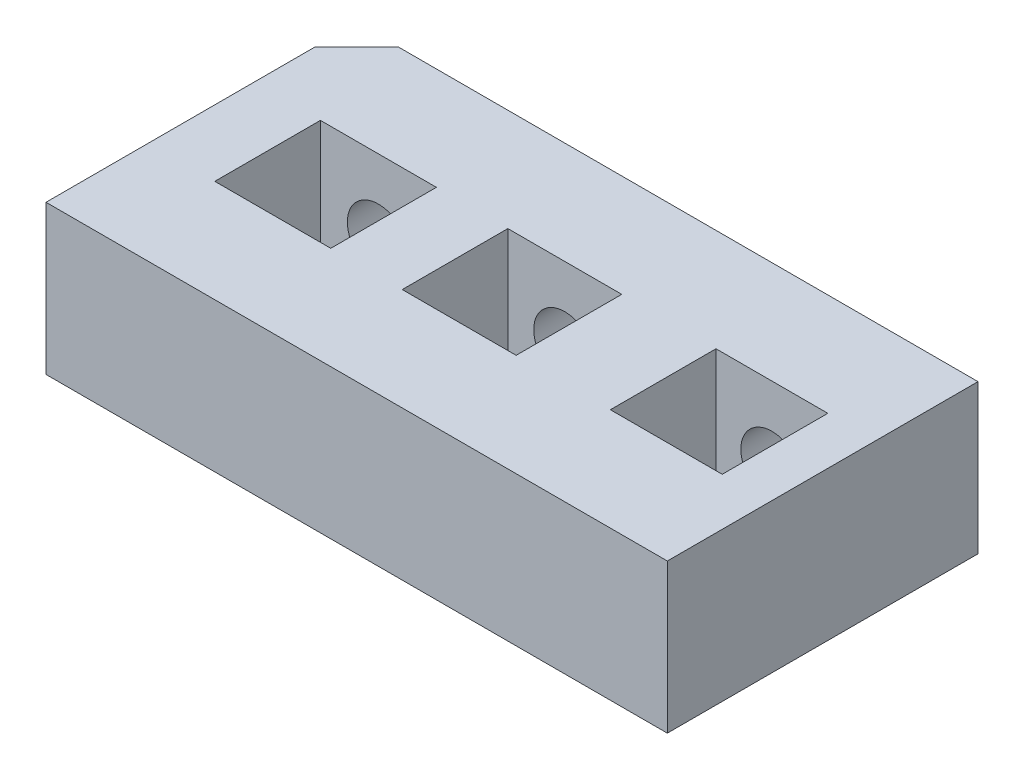
ISO-10303-21;
HEADER;
FILE_DESCRIPTION(('STEP AP214'),'2;1');
FILE_NAME('part.step','',(''),(''),'','','');
FILE_SCHEMA(('AUTOMOTIVE_DESIGN { 1 0 10303 214 1 1 1 1 }'));
ENDSEC;
DATA;
#1=APPLICATION_CONTEXT('core data for automotive mechanical design processes');
#2=APPLICATION_PROTOCOL_DEFINITION('international standard','automotive_design',2000,#1);
#3=PRODUCT_CONTEXT('',#1,'mechanical');
#4=PRODUCT('Part','Part','',(#3));
#5=PRODUCT_RELATED_PRODUCT_CATEGORY('part','',(#4));
#6=PRODUCT_DEFINITION_FORMATION('','',#4);
#7=PRODUCT_DEFINITION_CONTEXT('part definition',#1,'design');
#8=PRODUCT_DEFINITION('design','',#6,#7);
#9=PRODUCT_DEFINITION_SHAPE('','',#8);
#10=(LENGTH_UNIT() NAMED_UNIT(*) SI_UNIT(.MILLI.,.METRE.));
#11=(NAMED_UNIT(*) PLANE_ANGLE_UNIT() SI_UNIT($,.RADIAN.));
#12=(NAMED_UNIT(*) SI_UNIT($,.STERADIAN.) SOLID_ANGLE_UNIT());
#13=UNCERTAINTY_MEASURE_WITH_UNIT(LENGTH_MEASURE(1.E-05),#10,'distance_accuracy_value','');
#14=(GEOMETRIC_REPRESENTATION_CONTEXT(3) GLOBAL_UNCERTAINTY_ASSIGNED_CONTEXT((#13)) GLOBAL_UNIT_ASSIGNED_CONTEXT((#10,
#11,#12)) REPRESENTATION_CONTEXT('',''));
#15=CARTESIAN_POINT('',(0.,0.,0.));
#16=DIRECTION('',(0.,0.,1.));
#17=DIRECTION('',(1.,0.,0.));
#18=AXIS2_PLACEMENT_3D('',#15,#16,#17);
#19=CARTESIAN_POINT('',(15.,7.2,7.5));
#20=DIRECTION('',(-1.,0.,0.));
#21=DIRECTION('',(0.,0.,1.));
#22=AXIS2_PLACEMENT_3D('',#19,#20,#21);
#23=PLANE('',#22);
#24=DIRECTION('',(0.,0.,-1.));
#25=VECTOR('',#24,1.);
#26=CARTESIAN_POINT('',(15.,0.,7.5));
#27=LINE('',#26,#25);
#28=CARTESIAN_POINT('',(15.,0.,7.5));
#29=VERTEX_POINT('',#28);
#30=CARTESIAN_POINT('',(15.,0.,-7.5));
#31=VERTEX_POINT('',#30);
#32=EDGE_CURVE('E204',#29,#31,#27,.T.);
#33=ORIENTED_EDGE('',*,*,#32,.T.);
#34=DIRECTION('',(0.,-1.,0.));
#35=VECTOR('',#34,1.);
#36=CARTESIAN_POINT('',(15.,7.2,-7.5));
#37=LINE('',#36,#35);
#38=CARTESIAN_POINT('',(15.,7.2,-7.5));
#39=VERTEX_POINT('',#38);
#40=EDGE_CURVE('E295',#39,#31,#37,.T.);
#41=ORIENTED_EDGE('',*,*,#40,.F.);
#42=DIRECTION('',(0.,0.,-1.));
#43=VECTOR('',#42,1.);
#44=CARTESIAN_POINT('',(15.,7.2,7.5));
#45=LINE('',#44,#43);
#46=CARTESIAN_POINT('',(15.,7.2,7.5));
#47=VERTEX_POINT('',#46);
#48=EDGE_CURVE('E272',#47,#39,#45,.T.);
#49=ORIENTED_EDGE('',*,*,#48,.F.);
#50=DIRECTION('',(0.,-1.,0.));
#51=VECTOR('',#50,1.);
#52=CARTESIAN_POINT('',(15.,7.2,7.5));
#53=LINE('',#52,#51);
#54=EDGE_CURVE('E282',#47,#29,#53,.T.);
#55=ORIENTED_EDGE('',*,*,#54,.T.);
#56=EDGE_LOOP('',(#33,#41,#49,#55));
#57=FACE_BOUND('',#56,.T.);
#58=ADVANCED_FACE('F42',(#57),#23,.F.);
#59=CARTESIAN_POINT('',(-15.,7.2,-7.5));
#60=DIRECTION('',(0.,0.,1.));
#61=DIRECTION('',(1.,0.,0.));
#62=AXIS2_PLACEMENT_3D('',#59,#60,#61);
#63=PLANE('',#62);
#64=CARTESIAN_POINT('',(-8.99999999999997,3.6,-7.5));
#65=DIRECTION('',(0.,0.,-1.));
#66=DIRECTION('',(-1.,0.,0.));
#67=AXIS2_PLACEMENT_3D('',#64,#65,#66);
#68=CIRCLE('',#67,1.5);
#69=CARTESIAN_POINT('',(-10.5,3.6,-7.5));
#70=VERTEX_POINT('',#69);
#71=EDGE_CURVE('E303',#70,#70,#68,.T.);
#72=ORIENTED_EDGE('',*,*,#71,.F.);
#73=EDGE_LOOP('',(#72));
#74=FACE_BOUND('',#73,.T.);
#75=CARTESIAN_POINT('',(0.,3.6,-7.5));
#76=DIRECTION('',(0.,0.,-1.));
#77=DIRECTION('',(-1.,0.,0.));
#78=AXIS2_PLACEMENT_3D('',#75,#76,#77);
#79=CIRCLE('',#78,1.5);
#80=CARTESIAN_POINT('',(-1.49999999999997,3.6,-7.5));
#81=VERTEX_POINT('',#80);
#82=EDGE_CURVE('E410',#81,#81,#79,.T.);
#83=ORIENTED_EDGE('',*,*,#82,.F.);
#84=EDGE_LOOP('',(#83));
#85=FACE_BOUND('',#84,.T.);
#86=CARTESIAN_POINT('',(10.,3.6,-7.5));
#87=DIRECTION('',(0.,0.,-1.));
#88=DIRECTION('',(-1.,0.,0.));
#89=AXIS2_PLACEMENT_3D('',#86,#87,#88);
#90=CIRCLE('',#89,1.5);
#91=CARTESIAN_POINT('',(8.50000000000002,3.6,-7.5));
#92=VERTEX_POINT('',#91);
#93=EDGE_CURVE('E191',#92,#92,#90,.T.);
#94=ORIENTED_EDGE('',*,*,#93,.F.);
#95=EDGE_LOOP('',(#94));
#96=FACE_BOUND('',#95,.T.);
#97=DIRECTION('',(-1.,0.,0.));
#98=VECTOR('',#97,1.);
#99=CARTESIAN_POINT('',(-15.,0.,-7.5));
#100=LINE('',#99,#98);
#101=CARTESIAN_POINT('',(-13.,0.,-7.5));
#102=VERTEX_POINT('',#101);
#103=EDGE_CURVE('E285',#31,#102,#100,.T.);
#104=ORIENTED_EDGE('',*,*,#103,.T.);
#105=DIRECTION('',(0.,1.,0.));
#106=VECTOR('',#105,1.);
#107=CARTESIAN_POINT('',(-13.,7.2,-7.5));
#108=LINE('',#107,#106);
#109=CARTESIAN_POINT('',(-13.,7.2,-7.5));
#110=VERTEX_POINT('',#109);
#111=EDGE_CURVE('E51',#102,#110,#108,.T.);
#112=ORIENTED_EDGE('',*,*,#111,.T.);
#113=DIRECTION('',(-1.,0.,0.));
#114=VECTOR('',#113,1.);
#115=CARTESIAN_POINT('',(-15.,7.2,-7.5));
#116=LINE('',#115,#114);
#117=EDGE_CURVE('E275',#39,#110,#116,.T.);
#118=ORIENTED_EDGE('',*,*,#117,.F.);
#119=ORIENTED_EDGE('',*,*,#40,.T.);
#120=EDGE_LOOP('',(#104,#112,#118,#119));
#121=FACE_BOUND('',#120,.T.);
#122=ADVANCED_FACE('F337',(#74,#85,#96,#121),#63,.F.);
#123=CARTESIAN_POINT('',(-15.,7.2,7.5));
#124=DIRECTION('',(1.,0.,0.));
#125=DIRECTION('',(0.,0.,-1.));
#126=AXIS2_PLACEMENT_3D('',#123,#124,#125);
#127=PLANE('',#126);
#128=DIRECTION('',(0.,0.,1.));
#129=VECTOR('',#128,1.);
#130=CARTESIAN_POINT('',(-15.,7.2,7.5));
#131=LINE('',#130,#129);
#132=CARTESIAN_POINT('',(-15.,7.2,-5.5));
#133=VERTEX_POINT('',#132);
#134=CARTESIAN_POINT('',(-15.,7.2,7.5));
#135=VERTEX_POINT('',#134);
#136=EDGE_CURVE('E278',#133,#135,#131,.T.);
#137=ORIENTED_EDGE('',*,*,#136,.F.);
#138=DIRECTION('',(0.,-1.,0.));
#139=VECTOR('',#138,1.);
#140=CARTESIAN_POINT('',(-15.,7.2,-5.5));
#141=LINE('',#140,#139);
#142=CARTESIAN_POINT('',(-15.,0.,-5.5));
#143=VERTEX_POINT('',#142);
#144=EDGE_CURVE('E298',#133,#143,#141,.T.);
#145=ORIENTED_EDGE('',*,*,#144,.T.);
#146=DIRECTION('',(0.,0.,1.));
#147=VECTOR('',#146,1.);
#148=CARTESIAN_POINT('',(-15.,0.,7.5));
#149=LINE('',#148,#147);
#150=CARTESIAN_POINT('',(-15.,0.,7.5));
#151=VERTEX_POINT('',#150);
#152=EDGE_CURVE('E287',#143,#151,#149,.T.);
#153=ORIENTED_EDGE('',*,*,#152,.T.);
#154=DIRECTION('',(0.,-1.,0.));
#155=VECTOR('',#154,1.);
#156=CARTESIAN_POINT('',(-15.,7.2,7.5));
#157=LINE('',#156,#155);
#158=EDGE_CURVE('E292',#135,#151,#157,.T.);
#159=ORIENTED_EDGE('',*,*,#158,.F.);
#160=EDGE_LOOP('',(#137,#145,#153,#159));
#161=FACE_BOUND('',#160,.T.);
#162=ADVANCED_FACE('F313',(#161),#127,.F.);
#163=CARTESIAN_POINT('',(-15.,7.2,7.5));
#164=DIRECTION('',(0.,0.,-1.));
#165=DIRECTION('',(-1.,0.,0.));
#166=AXIS2_PLACEMENT_3D('',#163,#164,#165);
#167=PLANE('',#166);
#168=DIRECTION('',(1.,0.,0.));
#169=VECTOR('',#168,1.);
#170=CARTESIAN_POINT('',(-15.,0.,7.5));
#171=LINE('',#170,#169);
#172=EDGE_CURVE('E276',#151,#29,#171,.T.);
#173=ORIENTED_EDGE('',*,*,#172,.T.);
#174=ORIENTED_EDGE('',*,*,#54,.F.);
#175=DIRECTION('',(1.,0.,0.));
#176=VECTOR('',#175,1.);
#177=CARTESIAN_POINT('',(-15.,7.2,7.5));
#178=LINE('',#177,#176);
#179=EDGE_CURVE('E280',#135,#47,#178,.T.);
#180=ORIENTED_EDGE('',*,*,#179,.F.);
#181=ORIENTED_EDGE('',*,*,#158,.T.);
#182=EDGE_LOOP('',(#173,#174,#180,#181));
#183=FACE_BOUND('',#182,.T.);
#184=ADVANCED_FACE('F321',(#183),#167,.F.);
#185=CARTESIAN_POINT('',(0.,7.2,0.));
#186=DIRECTION('',(0.,-1.,0.));
#187=DIRECTION('',(0.,0.,-1.));
#188=AXIS2_PLACEMENT_3D('',#185,#186,#187);
#189=PLANE('',#188);
#190=DIRECTION('',(-1.,0.,0.));
#191=VECTOR('',#190,1.);
#192=CARTESIAN_POINT('',(-11.8,7.2,-2.55));
#193=LINE('',#192,#191);
#194=CARTESIAN_POINT('',(-6.19999999999998,7.2,-2.55));
#195=VERTEX_POINT('',#194);
#196=CARTESIAN_POINT('',(-11.8,7.2,-2.55));
#197=VERTEX_POINT('',#196);
#198=EDGE_CURVE('E197',#195,#197,#193,.T.);
#199=ORIENTED_EDGE('',*,*,#198,.F.);
#200=DIRECTION('',(0.,0.,-1.));
#201=VECTOR('',#200,1.);
#202=CARTESIAN_POINT('',(-6.19999999999998,7.2,2.55));
#203=LINE('',#202,#201);
#204=CARTESIAN_POINT('',(-6.19999999999998,7.2,2.55));
#205=VERTEX_POINT('',#204);
#206=EDGE_CURVE('E167',#205,#195,#203,.T.);
#207=ORIENTED_EDGE('',*,*,#206,.F.);
#208=DIRECTION('',(1.,0.,0.));
#209=VECTOR('',#208,1.);
#210=CARTESIAN_POINT('',(-11.8,7.2,2.55));
#211=LINE('',#210,#209);
#212=CARTESIAN_POINT('',(-11.8,7.2,2.55));
#213=VERTEX_POINT('',#212);
#214=EDGE_CURVE('E185',#213,#205,#211,.T.);
#215=ORIENTED_EDGE('',*,*,#214,.F.);
#216=DIRECTION('',(0.,0.,1.));
#217=VECTOR('',#216,1.);
#218=CARTESIAN_POINT('',(-11.8,7.2,2.55));
#219=LINE('',#218,#217);
#220=EDGE_CURVE('E188',#197,#213,#219,.T.);
#221=ORIENTED_EDGE('',*,*,#220,.F.);
#222=EDGE_LOOP('',(#199,#207,#215,#221));
#223=FACE_BOUND('',#222,.T.);
#224=DIRECTION('',(-1.,0.,0.));
#225=VECTOR('',#224,1.);
#226=CARTESIAN_POINT('',(-2.74999999999998,7.2,-2.55));
#227=LINE('',#226,#225);
#228=CARTESIAN_POINT('',(2.75000000000002,7.2,-2.55));
#229=VERTEX_POINT('',#228);
#230=CARTESIAN_POINT('',(-2.74999999999998,7.2,-2.55));
#231=VERTEX_POINT('',#230);
#232=EDGE_CURVE('E226',#229,#231,#227,.T.);
#233=ORIENTED_EDGE('',*,*,#232,.F.);
#234=DIRECTION('',(0.,0.,-1.));
#235=VECTOR('',#234,1.);
#236=CARTESIAN_POINT('',(2.75000000000002,7.2,2.55));
#237=LINE('',#236,#235);
#238=CARTESIAN_POINT('',(2.75000000000002,7.2,2.55));
#239=VERTEX_POINT('',#238);
#240=EDGE_CURVE('E198',#239,#229,#237,.T.);
#241=ORIENTED_EDGE('',*,*,#240,.F.);
#242=DIRECTION('',(1.,0.,0.));
#243=VECTOR('',#242,1.);
#244=CARTESIAN_POINT('',(-2.74999999999998,7.2,2.55));
#245=LINE('',#244,#243);
#246=CARTESIAN_POINT('',(-2.74999999999998,7.2,2.55));
#247=VERTEX_POINT('',#246);
#248=EDGE_CURVE('E219',#247,#239,#245,.T.);
#249=ORIENTED_EDGE('',*,*,#248,.F.);
#250=DIRECTION('',(0.,0.,1.));
#251=VECTOR('',#250,1.);
#252=CARTESIAN_POINT('',(-2.74999999999998,7.2,2.55));
#253=LINE('',#252,#251);
#254=EDGE_CURVE('E222',#231,#247,#253,.T.);
#255=ORIENTED_EDGE('',*,*,#254,.F.);
#256=EDGE_LOOP('',(#233,#241,#249,#255));
#257=FACE_BOUND('',#256,.T.);
#258=DIRECTION('',(-1.,0.,0.));
#259=VECTOR('',#258,1.);
#260=CARTESIAN_POINT('',(7.30000000000002,7.2,-2.55));
#261=LINE('',#260,#259);
#262=CARTESIAN_POINT('',(12.7,7.2,-2.55));
#263=VERTEX_POINT('',#262);
#264=CARTESIAN_POINT('',(7.30000000000002,7.2,-2.55));
#265=VERTEX_POINT('',#264);
#266=EDGE_CURVE('E258',#263,#265,#261,.T.);
#267=ORIENTED_EDGE('',*,*,#266,.F.);
#268=DIRECTION('',(0.,0.,-1.));
#269=VECTOR('',#268,1.);
#270=CARTESIAN_POINT('',(12.7,7.2,2.55));
#271=LINE('',#270,#269);
#272=CARTESIAN_POINT('',(12.7,7.2,2.55));
#273=VERTEX_POINT('',#272);
#274=EDGE_CURVE('E218',#273,#263,#271,.T.);
#275=ORIENTED_EDGE('',*,*,#274,.F.);
#276=DIRECTION('',(1.,0.,0.));
#277=VECTOR('',#276,1.);
#278=CARTESIAN_POINT('',(7.30000000000002,7.2,2.55));
#279=LINE('',#278,#277);
#280=CARTESIAN_POINT('',(7.30000000000002,7.2,2.55));
#281=VERTEX_POINT('',#280);
#282=EDGE_CURVE('E251',#281,#273,#279,.T.);
#283=ORIENTED_EDGE('',*,*,#282,.F.);
#284=DIRECTION('',(0.,0.,1.));
#285=VECTOR('',#284,1.);
#286=CARTESIAN_POINT('',(7.30000000000002,7.2,2.55));
#287=LINE('',#286,#285);
#288=EDGE_CURVE('E254',#265,#281,#287,.T.);
#289=ORIENTED_EDGE('',*,*,#288,.F.);
#290=EDGE_LOOP('',(#267,#275,#283,#289));
#291=FACE_BOUND('',#290,.T.);
#292=ORIENTED_EDGE('',*,*,#117,.T.);
#293=DIRECTION('',(0.707106781186548,0.,-0.707106781186547));
#294=VECTOR('',#293,1.);
#295=CARTESIAN_POINT('',(-15.,7.2,-5.5));
#296=LINE('',#295,#294);
#297=EDGE_CURVE('E11',#110,#133,#296,.F.);
#298=ORIENTED_EDGE('',*,*,#297,.T.);
#299=ORIENTED_EDGE('',*,*,#136,.T.);
#300=ORIENTED_EDGE('',*,*,#179,.T.);
#301=ORIENTED_EDGE('',*,*,#48,.T.);
#302=EDGE_LOOP('',(#292,#298,#299,#300,#301));
#303=FACE_BOUND('',#302,.T.);
#304=ADVANCED_FACE('F327',(#223,#257,#291,#303),#189,.F.);
#305=CARTESIAN_POINT('',(0.,0.,0.));
#306=DIRECTION('',(0.,-1.,0.));
#307=DIRECTION('',(0.,0.,-1.));
#308=AXIS2_PLACEMENT_3D('',#305,#306,#307);
#309=PLANE('',#308);
#310=DIRECTION('',(0.,0.,-1.));
#311=VECTOR('',#310,1.);
#312=CARTESIAN_POINT('',(-6.19999999999998,0.,2.55));
#313=LINE('',#312,#311);
#314=CARTESIAN_POINT('',(-6.19999999999998,0.,2.55));
#315=VERTEX_POINT('',#314);
#316=CARTESIAN_POINT('',(-6.19999999999998,0.,-2.55));
#317=VERTEX_POINT('',#316);
#318=EDGE_CURVE('E164',#315,#317,#313,.T.);
#319=ORIENTED_EDGE('',*,*,#318,.T.);
#320=DIRECTION('',(-1.,0.,0.));
#321=VECTOR('',#320,1.);
#322=CARTESIAN_POINT('',(-11.8,0.,-2.55));
#323=LINE('',#322,#321);
#324=CARTESIAN_POINT('',(-11.8,0.,-2.55));
#325=VERTEX_POINT('',#324);
#326=EDGE_CURVE('E176',#317,#325,#323,.T.);
#327=ORIENTED_EDGE('',*,*,#326,.T.);
#328=DIRECTION('',(0.,0.,1.));
#329=VECTOR('',#328,1.);
#330=CARTESIAN_POINT('',(-11.8,0.,2.55));
#331=LINE('',#330,#329);
#332=CARTESIAN_POINT('',(-11.8,0.,2.55));
#333=VERTEX_POINT('',#332);
#334=EDGE_CURVE('E180',#325,#333,#331,.T.);
#335=ORIENTED_EDGE('',*,*,#334,.T.);
#336=DIRECTION('',(1.,0.,0.));
#337=VECTOR('',#336,1.);
#338=CARTESIAN_POINT('',(-11.8,0.,2.55));
#339=LINE('',#338,#337);
#340=EDGE_CURVE('E172',#333,#315,#339,.T.);
#341=ORIENTED_EDGE('',*,*,#340,.T.);
#342=EDGE_LOOP('',(#319,#327,#335,#341));
#343=FACE_BOUND('',#342,.T.);
#344=DIRECTION('',(0.,0.,-1.));
#345=VECTOR('',#344,1.);
#346=CARTESIAN_POINT('',(2.75000000000002,0.,2.55));
#347=LINE('',#346,#345);
#348=CARTESIAN_POINT('',(2.75000000000002,0.,2.55));
#349=VERTEX_POINT('',#348);
#350=CARTESIAN_POINT('',(2.75000000000002,0.,-2.55));
#351=VERTEX_POINT('',#350);
#352=EDGE_CURVE('E223',#349,#351,#347,.T.);
#353=ORIENTED_EDGE('',*,*,#352,.T.);
#354=DIRECTION('',(-1.,0.,0.));
#355=VECTOR('',#354,1.);
#356=CARTESIAN_POINT('',(-2.74999999999998,0.,-2.55));
#357=LINE('',#356,#355);
#358=CARTESIAN_POINT('',(-2.74999999999998,0.,-2.55));
#359=VERTEX_POINT('',#358);
#360=EDGE_CURVE('E235',#351,#359,#357,.T.);
#361=ORIENTED_EDGE('',*,*,#360,.T.);
#362=DIRECTION('',(0.,0.,1.));
#363=VECTOR('',#362,1.);
#364=CARTESIAN_POINT('',(-2.74999999999998,0.,2.55));
#365=LINE('',#364,#363);
#366=CARTESIAN_POINT('',(-2.74999999999998,0.,2.55));
#367=VERTEX_POINT('',#366);
#368=EDGE_CURVE('E232',#359,#367,#365,.T.);
#369=ORIENTED_EDGE('',*,*,#368,.T.);
#370=DIRECTION('',(1.,0.,0.));
#371=VECTOR('',#370,1.);
#372=CARTESIAN_POINT('',(-2.74999999999998,0.,2.55));
#373=LINE('',#372,#371);
#374=EDGE_CURVE('E211',#367,#349,#373,.T.);
#375=ORIENTED_EDGE('',*,*,#374,.T.);
#376=EDGE_LOOP('',(#353,#361,#369,#375));
#377=FACE_BOUND('',#376,.T.);
#378=DIRECTION('',(0.,0.,-1.));
#379=VECTOR('',#378,1.);
#380=CARTESIAN_POINT('',(12.7,0.,2.55));
#381=LINE('',#380,#379);
#382=CARTESIAN_POINT('',(12.7,0.,2.55));
#383=VERTEX_POINT('',#382);
#384=CARTESIAN_POINT('',(12.7,0.,-2.55));
#385=VERTEX_POINT('',#384);
#386=EDGE_CURVE('E255',#383,#385,#381,.T.);
#387=ORIENTED_EDGE('',*,*,#386,.T.);
#388=DIRECTION('',(-1.,0.,0.));
#389=VECTOR('',#388,1.);
#390=CARTESIAN_POINT('',(7.30000000000002,0.,-2.55));
#391=LINE('',#390,#389);
#392=CARTESIAN_POINT('',(7.30000000000002,0.,-2.55));
#393=VERTEX_POINT('',#392);
#394=EDGE_CURVE('E267',#385,#393,#391,.T.);
#395=ORIENTED_EDGE('',*,*,#394,.T.);
#396=DIRECTION('',(0.,0.,1.));
#397=VECTOR('',#396,1.);
#398=CARTESIAN_POINT('',(7.30000000000002,0.,2.55));
#399=LINE('',#398,#397);
#400=CARTESIAN_POINT('',(7.30000000000002,0.,2.55));
#401=VERTEX_POINT('',#400);
#402=EDGE_CURVE('E264',#393,#401,#399,.T.);
#403=ORIENTED_EDGE('',*,*,#402,.T.);
#404=DIRECTION('',(1.,0.,0.));
#405=VECTOR('',#404,1.);
#406=CARTESIAN_POINT('',(7.30000000000002,0.,2.55));
#407=LINE('',#406,#405);
#408=EDGE_CURVE('E243',#401,#383,#407,.T.);
#409=ORIENTED_EDGE('',*,*,#408,.T.);
#410=EDGE_LOOP('',(#387,#395,#403,#409));
#411=FACE_BOUND('',#410,.T.);
#412=ORIENTED_EDGE('',*,*,#152,.F.);
#413=DIRECTION('',(-0.707106781186548,0.,0.707106781186547));
#414=VECTOR('',#413,1.);
#415=CARTESIAN_POINT('',(-10.25,0.,-10.25));
#416=LINE('',#415,#414);
#417=EDGE_CURVE('E65',#143,#102,#416,.F.);
#418=ORIENTED_EDGE('',*,*,#417,.T.);
#419=ORIENTED_EDGE('',*,*,#103,.F.);
#420=ORIENTED_EDGE('',*,*,#32,.F.);
#421=ORIENTED_EDGE('',*,*,#172,.F.);
#422=EDGE_LOOP('',(#412,#418,#419,#420,#421));
#423=FACE_BOUND('',#422,.T.);
#424=ADVANCED_FACE('F182',(#343,#377,#411,#423),#309,.T.);
#425=CARTESIAN_POINT('',(12.7,0.,2.55));
#426=DIRECTION('',(1.,0.,0.));
#427=DIRECTION('',(0.,0.,-1.));
#428=AXIS2_PLACEMENT_3D('',#425,#426,#427);
#429=PLANE('',#428);
#430=ORIENTED_EDGE('',*,*,#274,.T.);
#431=DIRECTION('',(0.,1.,0.));
#432=VECTOR('',#431,1.);
#433=CARTESIAN_POINT('',(12.7,0.,-2.55));
#434=LINE('',#433,#432);
#435=EDGE_CURVE('E240',#385,#263,#434,.T.);
#436=ORIENTED_EDGE('',*,*,#435,.F.);
#437=ORIENTED_EDGE('',*,*,#386,.F.);
#438=DIRECTION('',(0.,1.,0.));
#439=VECTOR('',#438,1.);
#440=CARTESIAN_POINT('',(12.7,0.,2.55));
#441=LINE('',#440,#439);
#442=EDGE_CURVE('E248',#383,#273,#441,.T.);
#443=ORIENTED_EDGE('',*,*,#442,.T.);
#444=EDGE_LOOP('',(#430,#436,#437,#443));
#445=FACE_BOUND('',#444,.T.);
#446=ADVANCED_FACE('F350',(#445),#429,.F.);
#447=CARTESIAN_POINT('',(7.30000000000002,0.,2.55));
#448=DIRECTION('',(0.,0.,1.));
#449=DIRECTION('',(1.,0.,0.));
#450=AXIS2_PLACEMENT_3D('',#447,#448,#449);
#451=PLANE('',#450);
#452=ORIENTED_EDGE('',*,*,#282,.T.);
#453=ORIENTED_EDGE('',*,*,#442,.F.);
#454=ORIENTED_EDGE('',*,*,#408,.F.);
#455=DIRECTION('',(0.,1.,0.));
#456=VECTOR('',#455,1.);
#457=CARTESIAN_POINT('',(7.30000000000002,0.,2.55));
#458=LINE('',#457,#456);
#459=EDGE_CURVE('E246',#401,#281,#458,.T.);
#460=ORIENTED_EDGE('',*,*,#459,.T.);
#461=EDGE_LOOP('',(#452,#453,#454,#460));
#462=FACE_BOUND('',#461,.T.);
#463=ADVANCED_FACE('F354',(#462),#451,.F.);
#464=CARTESIAN_POINT('',(7.30000000000002,0.,2.55));
#465=DIRECTION('',(-1.,0.,0.));
#466=DIRECTION('',(0.,0.,1.));
#467=AXIS2_PLACEMENT_3D('',#464,#465,#466);
#468=PLANE('',#467);
#469=ORIENTED_EDGE('',*,*,#288,.T.);
#470=ORIENTED_EDGE('',*,*,#459,.F.);
#471=ORIENTED_EDGE('',*,*,#402,.F.);
#472=DIRECTION('',(0.,1.,0.));
#473=VECTOR('',#472,1.);
#474=CARTESIAN_POINT('',(7.30000000000002,0.,-2.55));
#475=LINE('',#474,#473);
#476=EDGE_CURVE('E244',#393,#265,#475,.T.);
#477=ORIENTED_EDGE('',*,*,#476,.T.);
#478=EDGE_LOOP('',(#469,#470,#471,#477));
#479=FACE_BOUND('',#478,.T.);
#480=ADVANCED_FACE('F357',(#479),#468,.F.);
#481=CARTESIAN_POINT('',(7.30000000000002,0.,-2.55));
#482=DIRECTION('',(0.,0.,-1.));
#483=DIRECTION('',(-1.,0.,0.));
#484=AXIS2_PLACEMENT_3D('',#481,#482,#483);
#485=PLANE('',#484);
#486=CARTESIAN_POINT('',(10.,3.6,-2.55));
#487=DIRECTION('',(0.,0.,-1.));
#488=DIRECTION('',(-1.,0.,0.));
#489=AXIS2_PLACEMENT_3D('',#486,#487,#488);
#490=CIRCLE('',#489,1.5);
#491=CARTESIAN_POINT('',(8.50000000000002,3.6,-2.55));
#492=VERTEX_POINT('',#491);
#493=EDGE_CURVE('E250',#492,#492,#490,.T.);
#494=ORIENTED_EDGE('',*,*,#493,.T.);
#495=EDGE_LOOP('',(#494));
#496=FACE_BOUND('',#495,.T.);
#497=ORIENTED_EDGE('',*,*,#266,.T.);
#498=ORIENTED_EDGE('',*,*,#476,.F.);
#499=ORIENTED_EDGE('',*,*,#394,.F.);
#500=ORIENTED_EDGE('',*,*,#435,.T.);
#501=EDGE_LOOP('',(#497,#498,#499,#500));
#502=FACE_BOUND('',#501,.T.);
#503=ADVANCED_FACE('F361',(#496,#502),#485,.F.);
#504=CARTESIAN_POINT('',(2.75000000000002,0.,2.55));
#505=DIRECTION('',(1.,0.,0.));
#506=DIRECTION('',(0.,0.,-1.));
#507=AXIS2_PLACEMENT_3D('',#504,#505,#506);
#508=PLANE('',#507);
#509=ORIENTED_EDGE('',*,*,#240,.T.);
#510=DIRECTION('',(0.,1.,0.));
#511=VECTOR('',#510,1.);
#512=CARTESIAN_POINT('',(2.75000000000002,0.,-2.55));
#513=LINE('',#512,#511);
#514=EDGE_CURVE('E208',#351,#229,#513,.T.);
#515=ORIENTED_EDGE('',*,*,#514,.F.);
#516=ORIENTED_EDGE('',*,*,#352,.F.);
#517=DIRECTION('',(0.,1.,0.));
#518=VECTOR('',#517,1.);
#519=CARTESIAN_POINT('',(2.75000000000002,0.,2.55));
#520=LINE('',#519,#518);
#521=EDGE_CURVE('E216',#349,#239,#520,.T.);
#522=ORIENTED_EDGE('',*,*,#521,.T.);
#523=EDGE_LOOP('',(#509,#515,#516,#522));
#524=FACE_BOUND('',#523,.T.);
#525=ADVANCED_FACE('F365',(#524),#508,.F.);
#526=CARTESIAN_POINT('',(-2.74999999999998,0.,2.55));
#527=DIRECTION('',(0.,0.,1.));
#528=DIRECTION('',(1.,0.,0.));
#529=AXIS2_PLACEMENT_3D('',#526,#527,#528);
#530=PLANE('',#529);
#531=ORIENTED_EDGE('',*,*,#248,.T.);
#532=ORIENTED_EDGE('',*,*,#521,.F.);
#533=ORIENTED_EDGE('',*,*,#374,.F.);
#534=DIRECTION('',(0.,1.,0.));
#535=VECTOR('',#534,1.);
#536=CARTESIAN_POINT('',(-2.74999999999998,0.,2.55));
#537=LINE('',#536,#535);
#538=EDGE_CURVE('E214',#367,#247,#537,.T.);
#539=ORIENTED_EDGE('',*,*,#538,.T.);
#540=EDGE_LOOP('',(#531,#532,#533,#539));
#541=FACE_BOUND('',#540,.T.);
#542=ADVANCED_FACE('F370',(#541),#530,.F.);
#543=CARTESIAN_POINT('',(-2.74999999999998,0.,2.55));
#544=DIRECTION('',(-1.,0.,0.));
#545=DIRECTION('',(0.,0.,1.));
#546=AXIS2_PLACEMENT_3D('',#543,#544,#545);
#547=PLANE('',#546);
#548=ORIENTED_EDGE('',*,*,#254,.T.);
#549=ORIENTED_EDGE('',*,*,#538,.F.);
#550=ORIENTED_EDGE('',*,*,#368,.F.);
#551=DIRECTION('',(0.,1.,0.));
#552=VECTOR('',#551,1.);
#553=CARTESIAN_POINT('',(-2.74999999999998,0.,-2.55));
#554=LINE('',#553,#552);
#555=EDGE_CURVE('E212',#359,#231,#554,.T.);
#556=ORIENTED_EDGE('',*,*,#555,.T.);
#557=EDGE_LOOP('',(#548,#549,#550,#556));
#558=FACE_BOUND('',#557,.T.);
#559=ADVANCED_FACE('F373',(#558),#547,.F.);
#560=CARTESIAN_POINT('',(-2.74999999999998,0.,-2.55));
#561=DIRECTION('',(0.,0.,-1.));
#562=DIRECTION('',(-1.,0.,0.));
#563=AXIS2_PLACEMENT_3D('',#560,#561,#562);
#564=PLANE('',#563);
#565=CARTESIAN_POINT('',(0.,3.6,-2.55));
#566=DIRECTION('',(0.,0.,-1.));
#567=DIRECTION('',(-1.,0.,0.));
#568=AXIS2_PLACEMENT_3D('',#565,#566,#567);
#569=CIRCLE('',#568,1.5);
#570=CARTESIAN_POINT('',(-1.49999999999997,3.6,-2.55));
#571=VERTEX_POINT('',#570);
#572=EDGE_CURVE('E302',#571,#571,#569,.T.);
#573=ORIENTED_EDGE('',*,*,#572,.T.);
#574=EDGE_LOOP('',(#573));
#575=FACE_BOUND('',#574,.T.);
#576=ORIENTED_EDGE('',*,*,#232,.T.);
#577=ORIENTED_EDGE('',*,*,#555,.F.);
#578=ORIENTED_EDGE('',*,*,#360,.F.);
#579=ORIENTED_EDGE('',*,*,#514,.T.);
#580=EDGE_LOOP('',(#576,#577,#578,#579));
#581=FACE_BOUND('',#580,.T.);
#582=ADVANCED_FACE('F377',(#575,#581),#564,.F.);
#583=CARTESIAN_POINT('',(-6.19999999999998,0.,2.55));
#584=DIRECTION('',(1.,0.,0.));
#585=DIRECTION('',(0.,0.,-1.));
#586=AXIS2_PLACEMENT_3D('',#583,#584,#585);
#587=PLANE('',#586);
#588=ORIENTED_EDGE('',*,*,#206,.T.);
#589=DIRECTION('',(0.,1.,0.));
#590=VECTOR('',#589,1.);
#591=CARTESIAN_POINT('',(-6.19999999999998,0.,-2.55));
#592=LINE('',#591,#590);
#593=EDGE_CURVE('E160',#317,#195,#592,.T.);
#594=ORIENTED_EDGE('',*,*,#593,.F.);
#595=ORIENTED_EDGE('',*,*,#318,.F.);
#596=DIRECTION('',(0.,1.,0.));
#597=VECTOR('',#596,1.);
#598=CARTESIAN_POINT('',(-6.19999999999998,0.,2.55));
#599=LINE('',#598,#597);
#600=EDGE_CURVE('E202',#315,#205,#599,.T.);
#601=ORIENTED_EDGE('',*,*,#600,.T.);
#602=EDGE_LOOP('',(#588,#594,#595,#601));
#603=FACE_BOUND('',#602,.T.);
#604=ADVANCED_FACE('F162',(#603),#587,.F.);
#605=CARTESIAN_POINT('',(-11.8,0.,2.55));
#606=DIRECTION('',(0.,0.,1.));
#607=DIRECTION('',(1.,0.,0.));
#608=AXIS2_PLACEMENT_3D('',#605,#606,#607);
#609=PLANE('',#608);
#610=ORIENTED_EDGE('',*,*,#214,.T.);
#611=ORIENTED_EDGE('',*,*,#600,.F.);
#612=ORIENTED_EDGE('',*,*,#340,.F.);
#613=DIRECTION('',(0.,1.,0.));
#614=VECTOR('',#613,1.);
#615=CARTESIAN_POINT('',(-11.8,0.,2.55));
#616=LINE('',#615,#614);
#617=EDGE_CURVE('E205',#333,#213,#616,.T.);
#618=ORIENTED_EDGE('',*,*,#617,.T.);
#619=EDGE_LOOP('',(#610,#611,#612,#618));
#620=FACE_BOUND('',#619,.T.);
#621=ADVANCED_FACE('F387',(#620),#609,.F.);
#622=CARTESIAN_POINT('',(-11.8,0.,2.55));
#623=DIRECTION('',(-1.,0.,0.));
#624=DIRECTION('',(0.,0.,1.));
#625=AXIS2_PLACEMENT_3D('',#622,#623,#624);
#626=PLANE('',#625);
#627=ORIENTED_EDGE('',*,*,#220,.T.);
#628=ORIENTED_EDGE('',*,*,#617,.F.);
#629=ORIENTED_EDGE('',*,*,#334,.F.);
#630=DIRECTION('',(0.,1.,0.));
#631=VECTOR('',#630,1.);
#632=CARTESIAN_POINT('',(-11.8,0.,-2.55));
#633=LINE('',#632,#631);
#634=EDGE_CURVE('E171',#325,#197,#633,.T.);
#635=ORIENTED_EDGE('',*,*,#634,.T.);
#636=EDGE_LOOP('',(#627,#628,#629,#635));
#637=FACE_BOUND('',#636,.T.);
#638=ADVANCED_FACE('F391',(#637),#626,.F.);
#639=CARTESIAN_POINT('',(-11.8,0.,-2.55));
#640=DIRECTION('',(0.,0.,-1.));
#641=DIRECTION('',(-1.,0.,0.));
#642=AXIS2_PLACEMENT_3D('',#639,#640,#641);
#643=PLANE('',#642);
#644=CARTESIAN_POINT('',(-8.99999999999997,3.6,-2.55));
#645=DIRECTION('',(0.,0.,-1.));
#646=DIRECTION('',(-1.,0.,0.));
#647=AXIS2_PLACEMENT_3D('',#644,#645,#646);
#648=CIRCLE('',#647,1.5);
#649=CARTESIAN_POINT('',(-10.5,3.6,-2.55));
#650=VERTEX_POINT('',#649);
#651=EDGE_CURVE('E299',#650,#650,#648,.T.);
#652=ORIENTED_EDGE('',*,*,#651,.T.);
#653=EDGE_LOOP('',(#652));
#654=FACE_BOUND('',#653,.T.);
#655=ORIENTED_EDGE('',*,*,#198,.T.);
#656=ORIENTED_EDGE('',*,*,#634,.F.);
#657=ORIENTED_EDGE('',*,*,#326,.F.);
#658=ORIENTED_EDGE('',*,*,#593,.T.);
#659=EDGE_LOOP('',(#655,#656,#657,#658));
#660=FACE_BOUND('',#659,.T.);
#661=ADVANCED_FACE('F177',(#654,#660),#643,.F.);
#662=CARTESIAN_POINT('',(-8.99999999999997,3.6,-0.299999999999999));
#663=DIRECTION('',(0.,0.,-1.));
#664=DIRECTION('',(-1.,0.,0.));
#665=AXIS2_PLACEMENT_3D('',#662,#663,#664);
#666=CYLINDRICAL_SURFACE('',#665,1.5);
#667=ORIENTED_EDGE('',*,*,#71,.T.);
#668=EDGE_LOOP('',(#667));
#669=FACE_BOUND('',#668,.T.);
#670=ORIENTED_EDGE('',*,*,#651,.F.);
#671=EDGE_LOOP('',(#670));
#672=FACE_BOUND('',#671,.T.);
#673=ADVANCED_FACE('F390',(#669,#672),#666,.F.);
#674=CARTESIAN_POINT('',(0.,3.6,-0.299999999999999));
#675=DIRECTION('',(0.,0.,-1.));
#676=DIRECTION('',(-1.,0.,0.));
#677=AXIS2_PLACEMENT_3D('',#674,#675,#676);
#678=CYLINDRICAL_SURFACE('',#677,1.5);
#679=ORIENTED_EDGE('',*,*,#82,.T.);
#680=EDGE_LOOP('',(#679));
#681=FACE_BOUND('',#680,.T.);
#682=ORIENTED_EDGE('',*,*,#572,.F.);
#683=EDGE_LOOP('',(#682));
#684=FACE_BOUND('',#683,.T.);
#685=ADVANCED_FACE('F333',(#681,#684),#678,.F.);
#686=CARTESIAN_POINT('',(10.,3.6,-0.299999999999999));
#687=DIRECTION('',(0.,0.,-1.));
#688=DIRECTION('',(-1.,0.,0.));
#689=AXIS2_PLACEMENT_3D('',#686,#687,#688);
#690=CYLINDRICAL_SURFACE('',#689,1.5);
#691=ORIENTED_EDGE('',*,*,#93,.T.);
#692=EDGE_LOOP('',(#691));
#693=FACE_BOUND('',#692,.T.);
#694=ORIENTED_EDGE('',*,*,#493,.F.);
#695=EDGE_LOOP('',(#694));
#696=FACE_BOUND('',#695,.T.);
#697=ADVANCED_FACE('F329',(#693,#696),#690,.F.);
#698=CARTESIAN_POINT('',(-15.,7.2,-5.5));
#699=DIRECTION('',(0.707106781186547,0.,0.707106781186548));
#700=DIRECTION('',(0.,-1.,0.));
#701=AXIS2_PLACEMENT_3D('',#698,#699,#700);
#702=PLANE('',#701);
#703=ORIENTED_EDGE('',*,*,#297,.F.);
#704=ORIENTED_EDGE('',*,*,#111,.F.);
#705=ORIENTED_EDGE('',*,*,#417,.F.);
#706=ORIENTED_EDGE('',*,*,#144,.F.);
#707=EDGE_LOOP('',(#703,#704,#705,#706));
#708=FACE_BOUND('',#707,.T.);
#709=ADVANCED_FACE('F45',(#708),#702,.F.);
#710=CLOSED_SHELL('',(#58,#122,#162,#184,#304,#424,#446,#463,#480,#503,#525,#542,#559,#582,#604,
#621,#638,#661,#673,#685,#697,#709));
#711=MANIFOLD_SOLID_BREP('B2',#710);
#712=ADVANCED_BREP_SHAPE_REPRESENTATION('',(#18,#711),#14);
#713=SHAPE_DEFINITION_REPRESENTATION(#9,#712);
ENDSEC;
END-ISO-10303-21;
